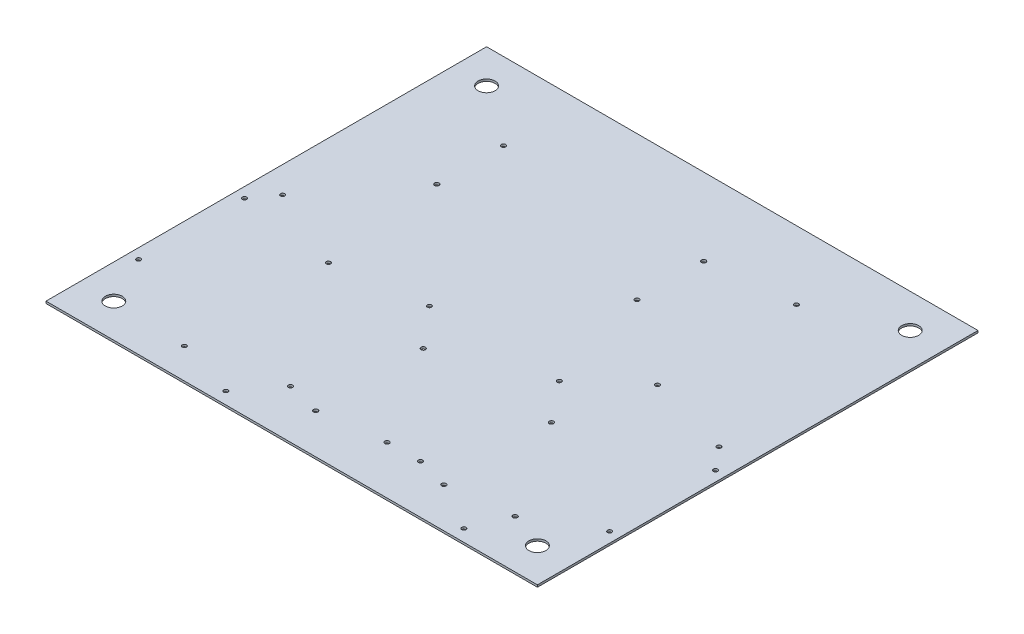
ISO-10303-21;
HEADER;
FILE_DESCRIPTION(('STEP AP214'),'2;1');
FILE_NAME('part.step','',(''),(''),'','','');
FILE_SCHEMA(('AUTOMOTIVE_DESIGN { 1 0 10303 214 1 1 1 1 }'));
ENDSEC;
DATA;
#1=APPLICATION_CONTEXT('core data for automotive mechanical design processes');
#2=APPLICATION_PROTOCOL_DEFINITION('international standard','automotive_design',2000,#1);
#3=PRODUCT_CONTEXT('',#1,'mechanical');
#4=PRODUCT('Part','Part','',(#3));
#5=PRODUCT_RELATED_PRODUCT_CATEGORY('part','',(#4));
#6=PRODUCT_DEFINITION_FORMATION('','',#4);
#7=PRODUCT_DEFINITION_CONTEXT('part definition',#1,'design');
#8=PRODUCT_DEFINITION('design','',#6,#7);
#9=PRODUCT_DEFINITION_SHAPE('','',#8);
#10=(LENGTH_UNIT() NAMED_UNIT(*) SI_UNIT(.MILLI.,.METRE.));
#11=(NAMED_UNIT(*) PLANE_ANGLE_UNIT() SI_UNIT($,.RADIAN.));
#12=(NAMED_UNIT(*) SI_UNIT($,.STERADIAN.) SOLID_ANGLE_UNIT());
#13=UNCERTAINTY_MEASURE_WITH_UNIT(LENGTH_MEASURE(1.E-05),#10,'distance_accuracy_value','');
#14=(GEOMETRIC_REPRESENTATION_CONTEXT(3) GLOBAL_UNCERTAINTY_ASSIGNED_CONTEXT((#13)) GLOBAL_UNIT_ASSIGNED_CONTEXT((#10,
#11,#12)) REPRESENTATION_CONTEXT('',''));
#15=CARTESIAN_POINT('',(0.,0.,0.));
#16=DIRECTION('',(0.,0.,1.));
#17=DIRECTION('',(1.,0.,0.));
#18=AXIS2_PLACEMENT_3D('',#15,#16,#17);
#19=CARTESIAN_POINT('',(184.15,1.5875,-165.1));
#20=DIRECTION('',(-1.,0.,0.));
#21=DIRECTION('',(0.,0.,1.));
#22=AXIS2_PLACEMENT_3D('',#19,#20,#21);
#23=PLANE('',#22);
#24=DIRECTION('',(0.,0.,-1.));
#25=VECTOR('',#24,1.);
#26=CARTESIAN_POINT('',(184.15,0.,-165.1));
#27=LINE('',#26,#25);
#28=CARTESIAN_POINT('',(184.15,0.,165.1));
#29=VERTEX_POINT('',#28);
#30=CARTESIAN_POINT('',(184.15,0.,-165.1));
#31=VERTEX_POINT('',#30);
#32=EDGE_CURVE('E107',#29,#31,#27,.T.);
#33=ORIENTED_EDGE('',*,*,#32,.T.);
#34=DIRECTION('',(0.,-1.,0.));
#35=VECTOR('',#34,1.);
#36=CARTESIAN_POINT('',(184.15,1.5875,-165.1));
#37=LINE('',#36,#35);
#38=CARTESIAN_POINT('',(184.15,1.5875,-165.1));
#39=VERTEX_POINT('',#38);
#40=EDGE_CURVE('E11',#39,#31,#37,.T.);
#41=ORIENTED_EDGE('',*,*,#40,.F.);
#42=DIRECTION('',(0.,0.,-1.));
#43=VECTOR('',#42,1.);
#44=CARTESIAN_POINT('',(184.15,1.5875,-165.1));
#45=LINE('',#44,#43);
#46=CARTESIAN_POINT('',(184.15,1.5875,165.1));
#47=VERTEX_POINT('',#46);
#48=EDGE_CURVE('E93',#47,#39,#45,.T.);
#49=ORIENTED_EDGE('',*,*,#48,.F.);
#50=DIRECTION('',(0.,-1.,0.));
#51=VECTOR('',#50,1.);
#52=CARTESIAN_POINT('',(184.15,1.5875,165.1));
#53=LINE('',#52,#51);
#54=EDGE_CURVE('E103',#47,#29,#53,.T.);
#55=ORIENTED_EDGE('',*,*,#54,.T.);
#56=EDGE_LOOP('',(#33,#41,#49,#55));
#57=FACE_BOUND('',#56,.T.);
#58=ADVANCED_FACE('F38',(#57),#23,.F.);
#59=CARTESIAN_POINT('',(-184.15,1.5875,-165.1));
#60=DIRECTION('',(0.,0.,1.));
#61=DIRECTION('',(1.,0.,0.));
#62=AXIS2_PLACEMENT_3D('',#59,#60,#61);
#63=PLANE('',#62);
#64=DIRECTION('',(-1.,0.,0.));
#65=VECTOR('',#64,1.);
#66=CARTESIAN_POINT('',(-184.15,0.,-165.1));
#67=LINE('',#66,#65);
#68=CARTESIAN_POINT('',(-184.15,0.,-165.1));
#69=VERTEX_POINT('',#68);
#70=EDGE_CURVE('E97',#31,#69,#67,.T.);
#71=ORIENTED_EDGE('',*,*,#70,.T.);
#72=DIRECTION('',(0.,-1.,0.));
#73=VECTOR('',#72,1.);
#74=CARTESIAN_POINT('',(-184.15,1.5875,-165.1));
#75=LINE('',#74,#73);
#76=CARTESIAN_POINT('',(-184.15,1.5875,-165.1));
#77=VERTEX_POINT('',#76);
#78=EDGE_CURVE('E47',#77,#69,#75,.T.);
#79=ORIENTED_EDGE('',*,*,#78,.F.);
#80=DIRECTION('',(-1.,0.,0.));
#81=VECTOR('',#80,1.);
#82=CARTESIAN_POINT('',(-184.15,1.5875,-165.1));
#83=LINE('',#82,#81);
#84=EDGE_CURVE('E88',#39,#77,#83,.T.);
#85=ORIENTED_EDGE('',*,*,#84,.F.);
#86=ORIENTED_EDGE('',*,*,#40,.T.);
#87=EDGE_LOOP('',(#71,#79,#85,#86));
#88=FACE_BOUND('',#87,.T.);
#89=ADVANCED_FACE('F96',(#88),#63,.F.);
#90=CARTESIAN_POINT('',(-184.15,1.5875,-165.1));
#91=DIRECTION('',(1.,0.,0.));
#92=DIRECTION('',(0.,0.,-1.));
#93=AXIS2_PLACEMENT_3D('',#90,#91,#92);
#94=PLANE('',#93);
#95=DIRECTION('',(0.,0.,1.));
#96=VECTOR('',#95,1.);
#97=CARTESIAN_POINT('',(-184.15,0.,-165.1));
#98=LINE('',#97,#96);
#99=CARTESIAN_POINT('',(-184.15,0.,165.1));
#100=VERTEX_POINT('',#99);
#101=EDGE_CURVE('E75',#69,#100,#98,.T.);
#102=ORIENTED_EDGE('',*,*,#101,.T.);
#103=DIRECTION('',(0.,-1.,0.));
#104=VECTOR('',#103,1.);
#105=CARTESIAN_POINT('',(-184.15,1.5875,165.1));
#106=LINE('',#105,#104);
#107=CARTESIAN_POINT('',(-184.15,1.5875,165.1));
#108=VERTEX_POINT('',#107);
#109=EDGE_CURVE('E98',#108,#100,#106,.T.);
#110=ORIENTED_EDGE('',*,*,#109,.F.);
#111=DIRECTION('',(0.,0.,1.));
#112=VECTOR('',#111,1.);
#113=CARTESIAN_POINT('',(-184.15,1.5875,-165.1));
#114=LINE('',#113,#112);
#115=EDGE_CURVE('E91',#77,#108,#114,.T.);
#116=ORIENTED_EDGE('',*,*,#115,.F.);
#117=ORIENTED_EDGE('',*,*,#78,.T.);
#118=EDGE_LOOP('',(#102,#110,#116,#117));
#119=FACE_BOUND('',#118,.T.);
#120=ADVANCED_FACE('F100',(#119),#94,.F.);
#121=CARTESIAN_POINT('',(-184.15,1.5875,165.1));
#122=DIRECTION('',(0.,0.,-1.));
#123=DIRECTION('',(-1.,0.,0.));
#124=AXIS2_PLACEMENT_3D('',#121,#122,#123);
#125=PLANE('',#124);
#126=DIRECTION('',(1.,0.,0.));
#127=VECTOR('',#126,1.);
#128=CARTESIAN_POINT('',(-184.15,0.,165.1));
#129=LINE('',#128,#127);
#130=EDGE_CURVE('E81',#100,#29,#129,.T.);
#131=ORIENTED_EDGE('',*,*,#130,.T.);
#132=ORIENTED_EDGE('',*,*,#54,.F.);
#133=DIRECTION('',(1.,0.,0.));
#134=VECTOR('',#133,1.);
#135=CARTESIAN_POINT('',(-184.15,1.5875,165.1));
#136=LINE('',#135,#134);
#137=EDGE_CURVE('E58',#108,#47,#136,.T.);
#138=ORIENTED_EDGE('',*,*,#137,.F.);
#139=ORIENTED_EDGE('',*,*,#109,.T.);
#140=EDGE_LOOP('',(#131,#132,#138,#139));
#141=FACE_BOUND('',#140,.T.);
#142=ADVANCED_FACE('F327',(#141),#125,.F.);
#143=CARTESIAN_POINT('',(0.,1.5875,0.));
#144=DIRECTION('',(0.,1.,0.));
#145=DIRECTION('',(0.,0.,1.));
#146=AXIS2_PLACEMENT_3D('',#143,#144,#145);
#147=PLANE('',#146);
#148=CARTESIAN_POINT('',(-103.15,1.5875,34.4000000000005));
#149=DIRECTION('',(0.,1.,0.));
#150=DIRECTION('',(0.,0.,1.));
#151=AXIS2_PLACEMENT_3D('',#148,#149,#150);
#152=CIRCLE('',#151,1.5875);
#153=CARTESIAN_POINT('',(-103.15,1.5875,35.9875000000005));
#154=VERTEX_POINT('',#153);
#155=EDGE_CURVE('E275',#154,#154,#152,.T.);
#156=ORIENTED_EDGE('',*,*,#155,.F.);
#157=EDGE_LOOP('',(#156));
#158=FACE_BOUND('',#157,.T.);
#159=CARTESIAN_POINT('',(-176.53,1.5875,103.365));
#160=DIRECTION('',(0.,1.,0.));
#161=DIRECTION('',(0.,0.,1.));
#162=AXIS2_PLACEMENT_3D('',#159,#160,#161);
#163=CIRCLE('',#162,1.58749999999999);
#164=CARTESIAN_POINT('',(-176.53,1.5875,104.9525));
#165=VERTEX_POINT('',#164);
#166=EDGE_CURVE('E280',#165,#165,#163,.T.);
#167=ORIENTED_EDGE('',*,*,#166,.F.);
#168=EDGE_LOOP('',(#167));
#169=FACE_BOUND('',#168,.T.);
#170=CARTESIAN_POINT('',(-176.53,1.5875,23.99));
#171=DIRECTION('',(0.,1.,0.));
#172=DIRECTION('',(0.,0.,1.));
#173=AXIS2_PLACEMENT_3D('',#170,#171,#172);
#174=CIRCLE('',#173,1.58749999999999);
#175=CARTESIAN_POINT('',(-176.53,1.5875,25.5775));
#176=VERTEX_POINT('',#175);
#177=EDGE_CURVE('E671',#176,#176,#174,.T.);
#178=ORIENTED_EDGE('',*,*,#177,.F.);
#179=EDGE_LOOP('',(#178));
#180=FACE_BOUND('',#179,.T.);
#181=CARTESIAN_POINT('',(-164.465,1.5875,7.47999999999999));
#182=DIRECTION('',(0.,1.,0.));
#183=DIRECTION('',(0.,0.,1.));
#184=AXIS2_PLACEMENT_3D('',#181,#182,#183);
#185=CIRCLE('',#184,1.58749999999999);
#186=CARTESIAN_POINT('',(-164.465,1.5875,9.06749999999997));
#187=VERTEX_POINT('',#186);
#188=EDGE_CURVE('E270',#187,#187,#185,.T.);
#189=ORIENTED_EDGE('',*,*,#188,.F.);
#190=EDGE_LOOP('',(#189));
#191=FACE_BOUND('',#190,.T.);
#192=CARTESIAN_POINT('',(176.53,1.5875,103.365));
#193=DIRECTION('',(0.,1.,0.));
#194=DIRECTION('',(0.,0.,1.));
#195=AXIS2_PLACEMENT_3D('',#192,#193,#194);
#196=CIRCLE('',#195,1.58749999999999);
#197=CARTESIAN_POINT('',(176.53,1.5875,104.9525));
#198=VERTEX_POINT('',#197);
#199=EDGE_CURVE('E264',#198,#198,#196,.T.);
#200=ORIENTED_EDGE('',*,*,#199,.F.);
#201=EDGE_LOOP('',(#200));
#202=FACE_BOUND('',#201,.T.);
#203=CARTESIAN_POINT('',(99.3723957699074,1.5875,-113.805));
#204=DIRECTION('',(0.,1.,0.));
#205=DIRECTION('',(0.,0.,1.));
#206=AXIS2_PLACEMENT_3D('',#203,#204,#205);
#207=CIRCLE('',#206,1.5875);
#208=CARTESIAN_POINT('',(99.3723957699074,1.5875,-112.2175));
#209=VERTEX_POINT('',#208);
#210=EDGE_CURVE('E681',#209,#209,#207,.T.);
#211=ORIENTED_EDGE('',*,*,#210,.F.);
#212=EDGE_LOOP('',(#211));
#213=FACE_BOUND('',#212,.T.);
#214=CARTESIAN_POINT('',(99.3723957699074,1.5875,-9.66499999999987));
#215=DIRECTION('',(0.,1.,0.));
#216=DIRECTION('',(0.,0.,1.));
#217=AXIS2_PLACEMENT_3D('',#214,#215,#216);
#218=CIRCLE('',#217,1.5875);
#219=CARTESIAN_POINT('',(99.3723957699074,1.5875,-8.07749999999987));
#220=VERTEX_POINT('',#219);
#221=EDGE_CURVE('E271',#220,#220,#218,.T.);
#222=ORIENTED_EDGE('',*,*,#221,.F.);
#223=EDGE_LOOP('',(#222));
#224=FACE_BOUND('',#223,.T.);
#225=CARTESIAN_POINT('',(162.56,1.5875,7.47999999999999));
#226=DIRECTION('',(0.,1.,0.));
#227=DIRECTION('',(0.,0.,1.));
#228=AXIS2_PLACEMENT_3D('',#225,#226,#227);
#229=CIRCLE('',#228,1.58749999999999);
#230=CARTESIAN_POINT('',(162.56,1.5875,9.06749999999997));
#231=VERTEX_POINT('',#230);
#232=EDGE_CURVE('E268',#231,#231,#229,.T.);
#233=ORIENTED_EDGE('',*,*,#232,.F.);
#234=EDGE_LOOP('',(#233));
#235=FACE_BOUND('',#234,.T.);
#236=CARTESIAN_POINT('',(-37.2337479726103,1.5875,24.625));
#237=DIRECTION('',(0.,1.,0.));
#238=DIRECTION('',(0.,0.,1.));
#239=AXIS2_PLACEMENT_3D('',#236,#237,#238);
#240=CIRCLE('',#239,1.5875);
#241=CARTESIAN_POINT('',(-37.2337479726103,1.5875,26.2125));
#242=VERTEX_POINT('',#241);
#243=EDGE_CURVE('E690',#242,#242,#240,.T.);
#244=ORIENTED_EDGE('',*,*,#243,.F.);
#245=EDGE_LOOP('',(#244));
#246=FACE_BOUND('',#245,.T.);
#247=CARTESIAN_POINT('',(60.1245495086379,1.5875,128.765));
#248=DIRECTION('',(0.,1.,0.));
#249=DIRECTION('',(0.,0.,1.));
#250=AXIS2_PLACEMENT_3D('',#247,#248,#249);
#251=CIRCLE('',#250,1.5875);
#252=CARTESIAN_POINT('',(60.1245495086379,1.5875,130.3525));
#253=VERTEX_POINT('',#252);
#254=EDGE_CURVE('E694',#253,#253,#251,.T.);
#255=ORIENTED_EDGE('',*,*,#254,.F.);
#256=EDGE_LOOP('',(#255));
#257=FACE_BOUND('',#256,.T.);
#258=CARTESIAN_POINT('',(60.1245495086379,1.5875,24.625));
#259=DIRECTION('',(0.,1.,0.));
#260=DIRECTION('',(0.,0.,1.));
#261=AXIS2_PLACEMENT_3D('',#258,#259,#260);
#262=CIRCLE('',#261,1.5875);
#263=CARTESIAN_POINT('',(60.1245495086379,1.5875,26.2125));
#264=VERTEX_POINT('',#263);
#265=EDGE_CURVE('E698',#264,#264,#262,.T.);
#266=ORIENTED_EDGE('',*,*,#265,.F.);
#267=EDGE_LOOP('',(#266));
#268=FACE_BOUND('',#267,.T.);
#269=CARTESIAN_POINT('',(-37.2337479726103,1.5875,128.765));
#270=DIRECTION('',(0.,1.,0.));
#271=DIRECTION('',(0.,0.,1.));
#272=AXIS2_PLACEMENT_3D('',#269,#270,#271);
#273=CIRCLE('',#272,1.5875);
#274=CARTESIAN_POINT('',(-37.2337479726103,1.5875,130.3525));
#275=VERTEX_POINT('',#274);
#276=EDGE_CURVE('E702',#275,#275,#273,.T.);
#277=ORIENTED_EDGE('',*,*,#276,.F.);
#278=EDGE_LOOP('',(#277));
#279=FACE_BOUND('',#278,.T.);
#280=CARTESIAN_POINT('',(-58.4149999999999,1.5875,156.07));
#281=DIRECTION('',(0.,1.,0.));
#282=DIRECTION('',(0.,0.,1.));
#283=AXIS2_PLACEMENT_3D('',#280,#281,#282);
#284=CIRCLE('',#283,1.5875);
#285=CARTESIAN_POINT('',(-58.4149999999999,1.5875,157.6575));
#286=VERTEX_POINT('',#285);
#287=EDGE_CURVE('E706',#286,#286,#284,.T.);
#288=ORIENTED_EDGE('',*,*,#287,.F.);
#289=EDGE_LOOP('',(#288));
#290=FACE_BOUND('',#289,.T.);
#291=CARTESIAN_POINT('',(120.02,1.5875,156.07));
#292=DIRECTION('',(0.,1.,0.));
#293=DIRECTION('',(0.,0.,1.));
#294=AXIS2_PLACEMENT_3D('',#291,#292,#293);
#295=CIRCLE('',#294,1.5875);
#296=CARTESIAN_POINT('',(120.02,1.5875,157.6575));
#297=VERTEX_POINT('',#296);
#298=EDGE_CURVE('E265',#297,#297,#295,.T.);
#299=ORIENTED_EDGE('',*,*,#298,.F.);
#300=EDGE_LOOP('',(#299));
#301=FACE_BOUND('',#300,.T.);
#302=CARTESIAN_POINT('',(176.53,1.5875,23.99));
#303=DIRECTION('',(0.,1.,0.));
#304=DIRECTION('',(0.,0.,1.));
#305=AXIS2_PLACEMENT_3D('',#302,#303,#304);
#306=CIRCLE('',#305,1.58749999999999);
#307=CARTESIAN_POINT('',(176.53,1.5875,25.5775));
#308=VERTEX_POINT('',#307);
#309=EDGE_CURVE('E262',#308,#308,#306,.T.);
#310=ORIENTED_EDGE('',*,*,#309,.F.);
#311=EDGE_LOOP('',(#310));
#312=FACE_BOUND('',#311,.T.);
#313=CARTESIAN_POINT('',(-103.15,1.5875,142.4));
#314=DIRECTION('',(0.,1.,0.));
#315=DIRECTION('',(0.,0.,1.));
#316=AXIS2_PLACEMENT_3D('',#313,#314,#315);
#317=CIRCLE('',#316,1.5875);
#318=CARTESIAN_POINT('',(-103.15,1.5875,143.9875));
#319=VERTEX_POINT('',#318);
#320=EDGE_CURVE('E124',#319,#319,#317,.T.);
#321=ORIENTED_EDGE('',*,*,#320,.F.);
#322=EDGE_LOOP('',(#321));
#323=FACE_BOUND('',#322,.T.);
#324=CARTESIAN_POINT('',(36.4499999999998,1.5875,-57.2000000000001));
#325=DIRECTION('',(0.,1.,0.));
#326=DIRECTION('',(0.,0.,1.));
#327=AXIS2_PLACEMENT_3D('',#324,#325,#326);
#328=CIRCLE('',#327,1.66499999999997);
#329=CARTESIAN_POINT('',(36.4499999999998,1.5875,-55.5350000000002));
#330=VERTEX_POINT('',#329);
#331=EDGE_CURVE('E172',#330,#330,#328,.T.);
#332=ORIENTED_EDGE('',*,*,#331,.F.);
#333=EDGE_LOOP('',(#332));
#334=FACE_BOUND('',#333,.T.);
#335=CARTESIAN_POINT('',(36.4499999999998,1.5875,-107.2));
#336=DIRECTION('',(0.,1.,0.));
#337=DIRECTION('',(0.,0.,1.));
#338=AXIS2_PLACEMENT_3D('',#335,#336,#337);
#339=CIRCLE('',#338,1.66500000000002);
#340=CARTESIAN_POINT('',(36.4499999999998,1.5875,-105.535));
#341=VERTEX_POINT('',#340);
#342=EDGE_CURVE('E181',#341,#341,#339,.T.);
#343=ORIENTED_EDGE('',*,*,#342,.F.);
#344=EDGE_LOOP('',(#343));
#345=FACE_BOUND('',#344,.T.);
#346=CARTESIAN_POINT('',(-113.55,1.5875,-107.2));
#347=DIRECTION('',(0.,1.,0.));
#348=DIRECTION('',(0.,0.,1.));
#349=AXIS2_PLACEMENT_3D('',#346,#347,#348);
#350=CIRCLE('',#349,1.66499999999996);
#351=CARTESIAN_POINT('',(-113.55,1.5875,-105.535));
#352=VERTEX_POINT('',#351);
#353=EDGE_CURVE('E284',#352,#352,#350,.T.);
#354=ORIENTED_EDGE('',*,*,#353,.F.);
#355=EDGE_LOOP('',(#354));
#356=FACE_BOUND('',#355,.T.);
#357=CARTESIAN_POINT('',(-113.55,1.5875,-57.2000000000002));
#358=DIRECTION('',(0.,1.,0.));
#359=DIRECTION('',(0.,0.,1.));
#360=AXIS2_PLACEMENT_3D('',#357,#358,#359);
#361=CIRCLE('',#360,1.66499999999996);
#362=CARTESIAN_POINT('',(-113.55,1.5875,-55.5350000000003));
#363=VERTEX_POINT('',#362);
#364=EDGE_CURVE('E187',#363,#363,#361,.T.);
#365=ORIENTED_EDGE('',*,*,#364,.F.);
#366=EDGE_LOOP('',(#365));
#367=FACE_BOUND('',#366,.T.);
#368=CARTESIAN_POINT('',(35.3434073054124,1.5875,128.976258797234));
#369=DIRECTION('',(0.,1.,0.));
#370=DIRECTION('',(0.,0.,1.));
#371=AXIS2_PLACEMENT_3D('',#368,#369,#370);
#372=CIRCLE('',#371,1.66500000000001);
#373=CARTESIAN_POINT('',(35.3434073054124,1.5875,130.641258797234));
#374=VERTEX_POINT('',#373);
#375=EDGE_CURVE('E207',#374,#374,#372,.F.);
#376=ORIENTED_EDGE('',*,*,#375,.T.);
#377=EDGE_LOOP('',(#376));
#378=FACE_BOUND('',#377,.T.);
#379=CARTESIAN_POINT('',(-12.0375887886655,1.5875,54.4642455034355));
#380=DIRECTION('',(0.,1.,0.));
#381=DIRECTION('',(0.,0.,1.));
#382=AXIS2_PLACEMENT_3D('',#379,#380,#381);
#383=CIRCLE('',#382,1.665);
#384=CARTESIAN_POINT('',(-12.0375887886655,1.5875,56.1292455034355));
#385=VERTEX_POINT('',#384);
#386=EDGE_CURVE('E213',#385,#385,#383,.F.);
#387=ORIENTED_EDGE('',*,*,#386,.T.);
#388=EDGE_LOOP('',(#387));
#389=FACE_BOUND('',#388,.T.);
#390=CARTESIAN_POINT('',(84.1208219470981,1.5875,135.184369152668));
#391=DIRECTION('',(0.,1.,0.));
#392=DIRECTION('',(0.,0.,1.));
#393=AXIS2_PLACEMENT_3D('',#390,#391,#392);
#394=CIRCLE('',#393,1.66500000000001);
#395=CARTESIAN_POINT('',(84.1208219470981,1.5875,136.849369152668));
#396=VERTEX_POINT('',#395);
#397=EDGE_CURVE('E220',#396,#396,#394,.F.);
#398=ORIENTED_EDGE('',*,*,#397,.T.);
#399=EDGE_LOOP('',(#398));
#400=FACE_BOUND('',#399,.T.);
#401=CARTESIAN_POINT('',(131.374103245115,1.5875,128.976258797234));
#402=DIRECTION('',(0.,1.,0.));
#403=DIRECTION('',(0.,0.,1.));
#404=AXIS2_PLACEMENT_3D('',#401,#402,#403);
#405=CIRCLE('',#404,1.66499999999999);
#406=CARTESIAN_POINT('',(131.374103245115,1.5875,130.641258797234));
#407=VERTEX_POINT('',#406);
#408=EDGE_CURVE('E199',#407,#407,#405,.F.);
#409=ORIENTED_EDGE('',*,*,#408,.T.);
#410=EDGE_LOOP('',(#409));
#411=FACE_BOUND('',#410,.T.);
#412=CARTESIAN_POINT('',(83.9931071510374,1.5875,54.4642455034354));
#413=DIRECTION('',(0.,1.,0.));
#414=DIRECTION('',(0.,0.,1.));
#415=AXIS2_PLACEMENT_3D('',#412,#413,#414);
#416=CIRCLE('',#415,1.66499999999999);
#417=CARTESIAN_POINT('',(83.9931071510374,1.5875,56.1292455034354));
#418=VERTEX_POINT('',#417);
#419=EDGE_CURVE('E194',#418,#418,#416,.F.);
#420=ORIENTED_EDGE('',*,*,#419,.T.);
#421=EDGE_LOOP('',(#420));
#422=FACE_BOUND('',#421,.T.);
#423=CARTESIAN_POINT('',(-11.9098739926048,1.5875,135.184369152668));
#424=DIRECTION('',(0.,1.,0.));
#425=DIRECTION('',(0.,0.,1.));
#426=AXIS2_PLACEMENT_3D('',#423,#424,#425);
#427=CIRCLE('',#426,1.66500000000002);
#428=CARTESIAN_POINT('',(-11.9098739926048,1.5875,136.849369152668));
#429=VERTEX_POINT('',#428);
#430=EDGE_CURVE('E206',#429,#429,#427,.F.);
#431=ORIENTED_EDGE('',*,*,#430,.T.);
#432=EDGE_LOOP('',(#431));
#433=FACE_BOUND('',#432,.T.);
#434=CARTESIAN_POINT('',(158.75,1.5875,139.7));
#435=DIRECTION('',(0.,1.,0.));
#436=DIRECTION('',(0.,0.,-1.));
#437=AXIS2_PLACEMENT_3D('',#434,#435,#436);
#438=CIRCLE('',#437,6.34999999999999);
#439=CARTESIAN_POINT('',(158.75,1.5875,133.35));
#440=VERTEX_POINT('',#439);
#441=EDGE_CURVE('E243',#440,#440,#438,.T.);
#442=ORIENTED_EDGE('',*,*,#441,.F.);
#443=EDGE_LOOP('',(#442));
#444=FACE_BOUND('',#443,.T.);
#445=CARTESIAN_POINT('',(-158.75,1.5875,-139.7));
#446=DIRECTION('',(0.,1.,0.));
#447=DIRECTION('',(0.,0.,-1.));
#448=AXIS2_PLACEMENT_3D('',#445,#446,#447);
#449=CIRCLE('',#448,6.34999999999999);
#450=CARTESIAN_POINT('',(-158.75,1.5875,-146.05));
#451=VERTEX_POINT('',#450);
#452=EDGE_CURVE('E242',#451,#451,#449,.T.);
#453=ORIENTED_EDGE('',*,*,#452,.F.);
#454=EDGE_LOOP('',(#453));
#455=FACE_BOUND('',#454,.T.);
#456=CARTESIAN_POINT('',(158.75,1.5875,-139.7));
#457=DIRECTION('',(0.,1.,0.));
#458=DIRECTION('',(0.,0.,1.));
#459=AXIS2_PLACEMENT_3D('',#456,#457,#458);
#460=CIRCLE('',#459,6.34999999999999);
#461=CARTESIAN_POINT('',(158.75,1.5875,-133.35));
#462=VERTEX_POINT('',#461);
#463=EDGE_CURVE('E234',#462,#462,#460,.T.);
#464=ORIENTED_EDGE('',*,*,#463,.F.);
#465=EDGE_LOOP('',(#464));
#466=FACE_BOUND('',#465,.T.);
#467=CARTESIAN_POINT('',(-158.75,1.5875,139.7));
#468=DIRECTION('',(0.,1.,0.));
#469=DIRECTION('',(0.,0.,1.));
#470=AXIS2_PLACEMENT_3D('',#467,#468,#469);
#471=CIRCLE('',#470,6.34999999999999);
#472=CARTESIAN_POINT('',(-158.75,1.5875,146.05));
#473=VERTEX_POINT('',#472);
#474=EDGE_CURVE('E252',#473,#473,#471,.T.);
#475=ORIENTED_EDGE('',*,*,#474,.F.);
#476=EDGE_LOOP('',(#475));
#477=FACE_BOUND('',#476,.T.);
#478=ORIENTED_EDGE('',*,*,#48,.T.);
#479=ORIENTED_EDGE('',*,*,#84,.T.);
#480=ORIENTED_EDGE('',*,*,#115,.T.);
#481=ORIENTED_EDGE('',*,*,#137,.T.);
#482=EDGE_LOOP('',(#478,#479,#480,#481));
#483=FACE_BOUND('',#482,.T.);
#484=ADVANCED_FACE('F89',(#158,#169,#180,#191,#202,#213,#224,#235,#246,#257,#268,#279,#290,#301,
#312,#323,#334,#345,#356,#367,#378,#389,#400,#411,#422,#433,#444,#455,#466,#477,#483),#147,.T.);
#485=CARTESIAN_POINT('',(0.,0.,0.));
#486=DIRECTION('',(0.,1.,0.));
#487=DIRECTION('',(0.,0.,1.));
#488=AXIS2_PLACEMENT_3D('',#485,#486,#487);
#489=PLANE('',#488);
#490=CARTESIAN_POINT('',(-103.15,0.,34.4000000000005));
#491=DIRECTION('',(0.,1.,0.));
#492=DIRECTION('',(0.,0.,1.));
#493=AXIS2_PLACEMENT_3D('',#490,#491,#492);
#494=CIRCLE('',#493,1.5875);
#495=CARTESIAN_POINT('',(-103.15,0.,35.9875000000005));
#496=VERTEX_POINT('',#495);
#497=EDGE_CURVE('E41',#496,#496,#494,.T.);
#498=ORIENTED_EDGE('',*,*,#497,.T.);
#499=EDGE_LOOP('',(#498));
#500=FACE_BOUND('',#499,.T.);
#501=CARTESIAN_POINT('',(-176.53,0.,103.365));
#502=DIRECTION('',(0.,1.,0.));
#503=DIRECTION('',(0.,0.,1.));
#504=AXIS2_PLACEMENT_3D('',#501,#502,#503);
#505=CIRCLE('',#504,1.58749999999999);
#506=CARTESIAN_POINT('',(-176.53,0.,104.9525));
#507=VERTEX_POINT('',#506);
#508=EDGE_CURVE('E166',#507,#507,#505,.T.);
#509=ORIENTED_EDGE('',*,*,#508,.T.);
#510=EDGE_LOOP('',(#509));
#511=FACE_BOUND('',#510,.T.);
#512=CARTESIAN_POINT('',(-176.53,0.,23.99));
#513=DIRECTION('',(0.,1.,0.));
#514=DIRECTION('',(0.,0.,1.));
#515=AXIS2_PLACEMENT_3D('',#512,#513,#514);
#516=CIRCLE('',#515,1.58749999999999);
#517=CARTESIAN_POINT('',(-176.53,0.,25.5775));
#518=VERTEX_POINT('',#517);
#519=EDGE_CURVE('E164',#518,#518,#516,.T.);
#520=ORIENTED_EDGE('',*,*,#519,.T.);
#521=EDGE_LOOP('',(#520));
#522=FACE_BOUND('',#521,.T.);
#523=CARTESIAN_POINT('',(-164.465,0.,7.47999999999999));
#524=DIRECTION('',(0.,1.,0.));
#525=DIRECTION('',(0.,0.,1.));
#526=AXIS2_PLACEMENT_3D('',#523,#524,#525);
#527=CIRCLE('',#526,1.58749999999999);
#528=CARTESIAN_POINT('',(-164.465,0.,9.06749999999997));
#529=VERTEX_POINT('',#528);
#530=EDGE_CURVE('E161',#529,#529,#527,.T.);
#531=ORIENTED_EDGE('',*,*,#530,.T.);
#532=EDGE_LOOP('',(#531));
#533=FACE_BOUND('',#532,.T.);
#534=CARTESIAN_POINT('',(176.53,0.,103.365));
#535=DIRECTION('',(0.,1.,0.));
#536=DIRECTION('',(0.,0.,1.));
#537=AXIS2_PLACEMENT_3D('',#534,#535,#536);
#538=CIRCLE('',#537,1.58749999999999);
#539=CARTESIAN_POINT('',(176.53,0.,104.9525));
#540=VERTEX_POINT('',#539);
#541=EDGE_CURVE('E157',#540,#540,#538,.T.);
#542=ORIENTED_EDGE('',*,*,#541,.T.);
#543=EDGE_LOOP('',(#542));
#544=FACE_BOUND('',#543,.T.);
#545=CARTESIAN_POINT('',(99.3723957699074,0.,-113.805));
#546=DIRECTION('',(0.,1.,0.));
#547=DIRECTION('',(0.,0.,1.));
#548=AXIS2_PLACEMENT_3D('',#545,#546,#547);
#549=CIRCLE('',#548,1.5875);
#550=CARTESIAN_POINT('',(99.3723957699074,0.,-112.2175));
#551=VERTEX_POINT('',#550);
#552=EDGE_CURVE('E154',#551,#551,#549,.T.);
#553=ORIENTED_EDGE('',*,*,#552,.T.);
#554=EDGE_LOOP('',(#553));
#555=FACE_BOUND('',#554,.T.);
#556=CARTESIAN_POINT('',(99.3723957699074,0.,-9.66499999999987));
#557=DIRECTION('',(0.,1.,0.));
#558=DIRECTION('',(0.,0.,1.));
#559=AXIS2_PLACEMENT_3D('',#556,#557,#558);
#560=CIRCLE('',#559,1.5875);
#561=CARTESIAN_POINT('',(99.3723957699074,0.,-8.07749999999987));
#562=VERTEX_POINT('',#561);
#563=EDGE_CURVE('E151',#562,#562,#560,.T.);
#564=ORIENTED_EDGE('',*,*,#563,.T.);
#565=EDGE_LOOP('',(#564));
#566=FACE_BOUND('',#565,.T.);
#567=CARTESIAN_POINT('',(162.56,0.,7.47999999999999));
#568=DIRECTION('',(0.,1.,0.));
#569=DIRECTION('',(0.,0.,1.));
#570=AXIS2_PLACEMENT_3D('',#567,#568,#569);
#571=CIRCLE('',#570,1.58749999999999);
#572=CARTESIAN_POINT('',(162.56,0.,9.06749999999997));
#573=VERTEX_POINT('',#572);
#574=EDGE_CURVE('E147',#573,#573,#571,.T.);
#575=ORIENTED_EDGE('',*,*,#574,.T.);
#576=EDGE_LOOP('',(#575));
#577=FACE_BOUND('',#576,.T.);
#578=CARTESIAN_POINT('',(-37.2337479726103,0.,24.625));
#579=DIRECTION('',(0.,1.,0.));
#580=DIRECTION('',(0.,0.,1.));
#581=AXIS2_PLACEMENT_3D('',#578,#579,#580);
#582=CIRCLE('',#581,1.5875);
#583=CARTESIAN_POINT('',(-37.2337479726103,0.,26.2125));
#584=VERTEX_POINT('',#583);
#585=EDGE_CURVE('E144',#584,#584,#582,.T.);
#586=ORIENTED_EDGE('',*,*,#585,.T.);
#587=EDGE_LOOP('',(#586));
#588=FACE_BOUND('',#587,.T.);
#589=CARTESIAN_POINT('',(60.1245495086379,0.,128.765));
#590=DIRECTION('',(0.,1.,0.));
#591=DIRECTION('',(0.,0.,1.));
#592=AXIS2_PLACEMENT_3D('',#589,#590,#591);
#593=CIRCLE('',#592,1.5875);
#594=CARTESIAN_POINT('',(60.1245495086379,0.,130.3525));
#595=VERTEX_POINT('',#594);
#596=EDGE_CURVE('E141',#595,#595,#593,.T.);
#597=ORIENTED_EDGE('',*,*,#596,.T.);
#598=EDGE_LOOP('',(#597));
#599=FACE_BOUND('',#598,.T.);
#600=CARTESIAN_POINT('',(60.1245495086379,0.,24.625));
#601=DIRECTION('',(0.,1.,0.));
#602=DIRECTION('',(0.,0.,1.));
#603=AXIS2_PLACEMENT_3D('',#600,#601,#602);
#604=CIRCLE('',#603,1.5875);
#605=CARTESIAN_POINT('',(60.1245495086379,0.,26.2125));
#606=VERTEX_POINT('',#605);
#607=EDGE_CURVE('E138',#606,#606,#604,.T.);
#608=ORIENTED_EDGE('',*,*,#607,.T.);
#609=EDGE_LOOP('',(#608));
#610=FACE_BOUND('',#609,.T.);
#611=CARTESIAN_POINT('',(-37.2337479726103,0.,128.765));
#612=DIRECTION('',(0.,1.,0.));
#613=DIRECTION('',(0.,0.,1.));
#614=AXIS2_PLACEMENT_3D('',#611,#612,#613);
#615=CIRCLE('',#614,1.5875);
#616=CARTESIAN_POINT('',(-37.2337479726103,0.,130.3525));
#617=VERTEX_POINT('',#616);
#618=EDGE_CURVE('E135',#617,#617,#615,.T.);
#619=ORIENTED_EDGE('',*,*,#618,.T.);
#620=EDGE_LOOP('',(#619));
#621=FACE_BOUND('',#620,.T.);
#622=CARTESIAN_POINT('',(-58.4149999999999,0.,156.07));
#623=DIRECTION('',(0.,1.,0.));
#624=DIRECTION('',(0.,0.,1.));
#625=AXIS2_PLACEMENT_3D('',#622,#623,#624);
#626=CIRCLE('',#625,1.5875);
#627=CARTESIAN_POINT('',(-58.4149999999999,0.,157.6575));
#628=VERTEX_POINT('',#627);
#629=EDGE_CURVE('E132',#628,#628,#626,.T.);
#630=ORIENTED_EDGE('',*,*,#629,.T.);
#631=EDGE_LOOP('',(#630));
#632=FACE_BOUND('',#631,.T.);
#633=CARTESIAN_POINT('',(120.02,0.,156.07));
#634=DIRECTION('',(0.,1.,0.));
#635=DIRECTION('',(0.,0.,1.));
#636=AXIS2_PLACEMENT_3D('',#633,#634,#635);
#637=CIRCLE('',#636,1.5875);
#638=CARTESIAN_POINT('',(120.02,0.,157.6575));
#639=VERTEX_POINT('',#638);
#640=EDGE_CURVE('E128',#639,#639,#637,.T.);
#641=ORIENTED_EDGE('',*,*,#640,.T.);
#642=EDGE_LOOP('',(#641));
#643=FACE_BOUND('',#642,.T.);
#644=CARTESIAN_POINT('',(176.53,0.,23.99));
#645=DIRECTION('',(0.,1.,0.));
#646=DIRECTION('',(0.,0.,1.));
#647=AXIS2_PLACEMENT_3D('',#644,#645,#646);
#648=CIRCLE('',#647,1.58749999999999);
#649=CARTESIAN_POINT('',(176.53,0.,25.5775));
#650=VERTEX_POINT('',#649);
#651=EDGE_CURVE('E123',#650,#650,#648,.T.);
#652=ORIENTED_EDGE('',*,*,#651,.T.);
#653=EDGE_LOOP('',(#652));
#654=FACE_BOUND('',#653,.T.);
#655=CARTESIAN_POINT('',(-103.15,0.,142.4));
#656=DIRECTION('',(0.,1.,0.));
#657=DIRECTION('',(0.,0.,1.));
#658=AXIS2_PLACEMENT_3D('',#655,#656,#657);
#659=CIRCLE('',#658,1.5875);
#660=CARTESIAN_POINT('',(-103.15,0.,143.9875));
#661=VERTEX_POINT('',#660);
#662=EDGE_CURVE('E119',#661,#661,#659,.T.);
#663=ORIENTED_EDGE('',*,*,#662,.T.);
#664=EDGE_LOOP('',(#663));
#665=FACE_BOUND('',#664,.T.);
#666=CARTESIAN_POINT('',(36.4499999999998,0.,-57.2000000000001));
#667=DIRECTION('',(0.,1.,0.));
#668=DIRECTION('',(0.,0.,1.));
#669=AXIS2_PLACEMENT_3D('',#666,#667,#668);
#670=CIRCLE('',#669,1.66499999999997);
#671=CARTESIAN_POINT('',(36.4499999999998,0.,-55.5350000000002));
#672=VERTEX_POINT('',#671);
#673=EDGE_CURVE('E176',#672,#672,#670,.F.);
#674=ORIENTED_EDGE('',*,*,#673,.F.);
#675=EDGE_LOOP('',(#674));
#676=FACE_BOUND('',#675,.T.);
#677=CARTESIAN_POINT('',(36.4499999999998,0.,-107.2));
#678=DIRECTION('',(0.,1.,0.));
#679=DIRECTION('',(0.,0.,1.));
#680=AXIS2_PLACEMENT_3D('',#677,#678,#679);
#681=CIRCLE('',#680,1.66500000000002);
#682=CARTESIAN_POINT('',(36.4499999999998,0.,-105.535));
#683=VERTEX_POINT('',#682);
#684=EDGE_CURVE('E184',#683,#683,#681,.F.);
#685=ORIENTED_EDGE('',*,*,#684,.F.);
#686=EDGE_LOOP('',(#685));
#687=FACE_BOUND('',#686,.T.);
#688=CARTESIAN_POINT('',(-113.55,0.,-107.2));
#689=DIRECTION('',(0.,1.,0.));
#690=DIRECTION('',(0.,0.,1.));
#691=AXIS2_PLACEMENT_3D('',#688,#689,#690);
#692=CIRCLE('',#691,1.66499999999996);
#693=CARTESIAN_POINT('',(-113.55,0.,-105.535));
#694=VERTEX_POINT('',#693);
#695=EDGE_CURVE('E191',#694,#694,#692,.F.);
#696=ORIENTED_EDGE('',*,*,#695,.F.);
#697=EDGE_LOOP('',(#696));
#698=FACE_BOUND('',#697,.T.);
#699=CARTESIAN_POINT('',(-113.55,0.,-57.2000000000002));
#700=DIRECTION('',(0.,1.,0.));
#701=DIRECTION('',(0.,0.,1.));
#702=AXIS2_PLACEMENT_3D('',#699,#700,#701);
#703=CIRCLE('',#702,1.66499999999996);
#704=CARTESIAN_POINT('',(-113.55,0.,-55.5350000000003));
#705=VERTEX_POINT('',#704);
#706=EDGE_CURVE('E190',#705,#705,#703,.F.);
#707=ORIENTED_EDGE('',*,*,#706,.F.);
#708=EDGE_LOOP('',(#707));
#709=FACE_BOUND('',#708,.T.);
#710=CARTESIAN_POINT('',(35.3434073054124,0.,128.976258797234));
#711=DIRECTION('',(0.,-1.,0.));
#712=DIRECTION('',(0.,0.,-1.));
#713=AXIS2_PLACEMENT_3D('',#710,#711,#712);
#714=CIRCLE('',#713,1.66500000000001);
#715=CARTESIAN_POINT('',(35.3434073054124,0.,127.311258797234));
#716=VERTEX_POINT('',#715);
#717=EDGE_CURVE('E203',#716,#716,#714,.T.);
#718=ORIENTED_EDGE('',*,*,#717,.F.);
#719=EDGE_LOOP('',(#718));
#720=FACE_BOUND('',#719,.T.);
#721=CARTESIAN_POINT('',(-12.0375887886655,0.,54.4642455034355));
#722=DIRECTION('',(0.,-1.,0.));
#723=DIRECTION('',(0.,0.,-1.));
#724=AXIS2_PLACEMENT_3D('',#721,#722,#723);
#725=CIRCLE('',#724,1.665);
#726=CARTESIAN_POINT('',(-12.0375887886655,0.,52.7992455034355));
#727=VERTEX_POINT('',#726);
#728=EDGE_CURVE('E210',#727,#727,#725,.T.);
#729=ORIENTED_EDGE('',*,*,#728,.F.);
#730=EDGE_LOOP('',(#729));
#731=FACE_BOUND('',#730,.T.);
#732=CARTESIAN_POINT('',(84.1208219470981,0.,135.184369152668));
#733=DIRECTION('',(0.,-1.,0.));
#734=DIRECTION('',(0.,0.,-1.));
#735=AXIS2_PLACEMENT_3D('',#732,#733,#734);
#736=CIRCLE('',#735,1.66500000000001);
#737=CARTESIAN_POINT('',(84.1208219470981,0.,133.519369152668));
#738=VERTEX_POINT('',#737);
#739=EDGE_CURVE('E216',#738,#738,#736,.T.);
#740=ORIENTED_EDGE('',*,*,#739,.F.);
#741=EDGE_LOOP('',(#740));
#742=FACE_BOUND('',#741,.T.);
#743=CARTESIAN_POINT('',(131.374103245115,0.,128.976258797234));
#744=DIRECTION('',(0.,-1.,0.));
#745=DIRECTION('',(0.,0.,-1.));
#746=AXIS2_PLACEMENT_3D('',#743,#744,#745);
#747=CIRCLE('',#746,1.66499999999999);
#748=CARTESIAN_POINT('',(131.374103245115,0.,127.311258797234));
#749=VERTEX_POINT('',#748);
#750=EDGE_CURVE('E224',#749,#749,#747,.T.);
#751=ORIENTED_EDGE('',*,*,#750,.F.);
#752=EDGE_LOOP('',(#751));
#753=FACE_BOUND('',#752,.T.);
#754=CARTESIAN_POINT('',(83.9931071510374,0.,54.4642455034354));
#755=DIRECTION('',(0.,-1.,0.));
#756=DIRECTION('',(0.,0.,-1.));
#757=AXIS2_PLACEMENT_3D('',#754,#755,#756);
#758=CIRCLE('',#757,1.66499999999999);
#759=CARTESIAN_POINT('',(83.9931071510374,0.,52.7992455034354));
#760=VERTEX_POINT('',#759);
#761=EDGE_CURVE('E195',#760,#760,#758,.T.);
#762=ORIENTED_EDGE('',*,*,#761,.F.);
#763=EDGE_LOOP('',(#762));
#764=FACE_BOUND('',#763,.T.);
#765=CARTESIAN_POINT('',(-11.9098739926048,0.,135.184369152668));
#766=DIRECTION('',(0.,-1.,0.));
#767=DIRECTION('',(0.,0.,-1.));
#768=AXIS2_PLACEMENT_3D('',#765,#766,#767);
#769=CIRCLE('',#768,1.66500000000002);
#770=CARTESIAN_POINT('',(-11.9098739926048,0.,133.519369152668));
#771=VERTEX_POINT('',#770);
#772=EDGE_CURVE('E231',#771,#771,#769,.T.);
#773=ORIENTED_EDGE('',*,*,#772,.F.);
#774=EDGE_LOOP('',(#773));
#775=FACE_BOUND('',#774,.T.);
#776=CARTESIAN_POINT('',(158.75,0.,139.7));
#777=DIRECTION('',(0.,1.,0.));
#778=DIRECTION('',(0.,0.,1.));
#779=AXIS2_PLACEMENT_3D('',#776,#777,#778);
#780=CIRCLE('',#779,6.34999999999999);
#781=CARTESIAN_POINT('',(158.75,0.,146.05));
#782=VERTEX_POINT('',#781);
#783=EDGE_CURVE('E247',#782,#782,#780,.F.);
#784=ORIENTED_EDGE('',*,*,#783,.F.);
#785=EDGE_LOOP('',(#784));
#786=FACE_BOUND('',#785,.T.);
#787=CARTESIAN_POINT('',(-158.75,0.,-139.7));
#788=DIRECTION('',(0.,1.,0.));
#789=DIRECTION('',(0.,0.,1.));
#790=AXIS2_PLACEMENT_3D('',#787,#788,#789);
#791=CIRCLE('',#790,6.34999999999999);
#792=CARTESIAN_POINT('',(-158.75,0.,-133.35));
#793=VERTEX_POINT('',#792);
#794=EDGE_CURVE('E248',#793,#793,#791,.F.);
#795=ORIENTED_EDGE('',*,*,#794,.F.);
#796=EDGE_LOOP('',(#795));
#797=FACE_BOUND('',#796,.T.);
#798=CARTESIAN_POINT('',(158.75,0.,-139.7));
#799=DIRECTION('',(0.,1.,0.));
#800=DIRECTION('',(0.,0.,1.));
#801=AXIS2_PLACEMENT_3D('',#798,#799,#800);
#802=CIRCLE('',#801,6.34999999999999);
#803=CARTESIAN_POINT('',(158.75,0.,-133.35));
#804=VERTEX_POINT('',#803);
#805=EDGE_CURVE('E239',#804,#804,#802,.F.);
#806=ORIENTED_EDGE('',*,*,#805,.F.);
#807=EDGE_LOOP('',(#806));
#808=FACE_BOUND('',#807,.T.);
#809=CARTESIAN_POINT('',(-158.75,0.,139.7));
#810=DIRECTION('',(0.,1.,0.));
#811=DIRECTION('',(0.,0.,1.));
#812=AXIS2_PLACEMENT_3D('',#809,#810,#811);
#813=CIRCLE('',#812,6.34999999999999);
#814=CARTESIAN_POINT('',(-158.75,0.,146.05));
#815=VERTEX_POINT('',#814);
#816=EDGE_CURVE('E111',#815,#815,#813,.F.);
#817=ORIENTED_EDGE('',*,*,#816,.F.);
#818=EDGE_LOOP('',(#817));
#819=FACE_BOUND('',#818,.T.);
#820=ORIENTED_EDGE('',*,*,#32,.F.);
#821=ORIENTED_EDGE('',*,*,#130,.F.);
#822=ORIENTED_EDGE('',*,*,#101,.F.);
#823=ORIENTED_EDGE('',*,*,#70,.F.);
#824=EDGE_LOOP('',(#820,#821,#822,#823));
#825=FACE_BOUND('',#824,.T.);
#826=ADVANCED_FACE('F296',(#500,#511,#522,#533,#544,#555,#566,#577,#588,#599,#610,#621,#632,
#643,#654,#665,#676,#687,#698,#709,#720,#731,#742,#753,#764,#775,#786,#797,#808,#819,#825),#489,.F.);
#827=CARTESIAN_POINT('',(-158.75,-0.000999999999999916,139.7));
#828=DIRECTION('',(0.,1.,0.));
#829=DIRECTION('',(0.,0.,1.));
#830=AXIS2_PLACEMENT_3D('',#827,#828,#829);
#831=CYLINDRICAL_SURFACE('',#830,6.34999999999999);
#832=ORIENTED_EDGE('',*,*,#474,.T.);
#833=EDGE_LOOP('',(#832));
#834=FACE_BOUND('',#833,.T.);
#835=ORIENTED_EDGE('',*,*,#816,.T.);
#836=EDGE_LOOP('',(#835));
#837=FACE_BOUND('',#836,.T.);
#838=ADVANCED_FACE('F299',(#834,#837),#831,.F.);
#839=CARTESIAN_POINT('',(158.75,-0.000999999999999916,-139.7));
#840=DIRECTION('',(0.,1.,0.));
#841=DIRECTION('',(0.,0.,1.));
#842=AXIS2_PLACEMENT_3D('',#839,#840,#841);
#843=CYLINDRICAL_SURFACE('',#842,6.34999999999999);
#844=ORIENTED_EDGE('',*,*,#463,.T.);
#845=EDGE_LOOP('',(#844));
#846=FACE_BOUND('',#845,.T.);
#847=ORIENTED_EDGE('',*,*,#805,.T.);
#848=EDGE_LOOP('',(#847));
#849=FACE_BOUND('',#848,.T.);
#850=ADVANCED_FACE('F361',(#846,#849),#843,.F.);
#851=CARTESIAN_POINT('',(-158.75,-0.000999999999999916,-139.7));
#852=DIRECTION('',(0.,1.,0.));
#853=DIRECTION('',(0.,0.,1.));
#854=AXIS2_PLACEMENT_3D('',#851,#852,#853);
#855=CYLINDRICAL_SURFACE('',#854,6.34999999999999);
#856=ORIENTED_EDGE('',*,*,#452,.T.);
#857=EDGE_LOOP('',(#856));
#858=FACE_BOUND('',#857,.T.);
#859=ORIENTED_EDGE('',*,*,#794,.T.);
#860=EDGE_LOOP('',(#859));
#861=FACE_BOUND('',#860,.T.);
#862=ADVANCED_FACE('F372',(#858,#861),#855,.F.);
#863=CARTESIAN_POINT('',(158.75,-0.000999999999999916,139.7));
#864=DIRECTION('',(0.,1.,0.));
#865=DIRECTION('',(0.,0.,1.));
#866=AXIS2_PLACEMENT_3D('',#863,#864,#865);
#867=CYLINDRICAL_SURFACE('',#866,6.34999999999999);
#868=ORIENTED_EDGE('',*,*,#441,.T.);
#869=EDGE_LOOP('',(#868));
#870=FACE_BOUND('',#869,.T.);
#871=ORIENTED_EDGE('',*,*,#783,.T.);
#872=EDGE_LOOP('',(#871));
#873=FACE_BOUND('',#872,.T.);
#874=ADVANCED_FACE('F382',(#870,#873),#867,.F.);
#875=CARTESIAN_POINT('',(-11.9098739926048,1.5885,135.184369152668));
#876=DIRECTION('',(0.,-1.,0.));
#877=DIRECTION('',(0.,0.,-1.));
#878=AXIS2_PLACEMENT_3D('',#875,#876,#877);
#879=CYLINDRICAL_SURFACE('',#878,1.66500000000002);
#880=ORIENTED_EDGE('',*,*,#430,.F.);
#881=EDGE_LOOP('',(#880));
#882=FACE_BOUND('',#881,.T.);
#883=ORIENTED_EDGE('',*,*,#772,.T.);
#884=EDGE_LOOP('',(#883));
#885=FACE_BOUND('',#884,.T.);
#886=ADVANCED_FACE('F393',(#882,#885),#879,.F.);
#887=CARTESIAN_POINT('',(83.9931071510374,1.5885,54.4642455034354));
#888=DIRECTION('',(0.,-1.,0.));
#889=DIRECTION('',(0.,0.,-1.));
#890=AXIS2_PLACEMENT_3D('',#887,#888,#889);
#891=CYLINDRICAL_SURFACE('',#890,1.66499999999999);
#892=ORIENTED_EDGE('',*,*,#419,.F.);
#893=EDGE_LOOP('',(#892));
#894=FACE_BOUND('',#893,.T.);
#895=ORIENTED_EDGE('',*,*,#761,.T.);
#896=EDGE_LOOP('',(#895));
#897=FACE_BOUND('',#896,.T.);
#898=ADVANCED_FACE('F403',(#894,#897),#891,.F.);
#899=CARTESIAN_POINT('',(131.374103245115,1.5885,128.976258797234));
#900=DIRECTION('',(0.,-1.,0.));
#901=DIRECTION('',(0.,0.,-1.));
#902=AXIS2_PLACEMENT_3D('',#899,#900,#901);
#903=CYLINDRICAL_SURFACE('',#902,1.66499999999999);
#904=ORIENTED_EDGE('',*,*,#408,.F.);
#905=EDGE_LOOP('',(#904));
#906=FACE_BOUND('',#905,.T.);
#907=ORIENTED_EDGE('',*,*,#750,.T.);
#908=EDGE_LOOP('',(#907));
#909=FACE_BOUND('',#908,.T.);
#910=ADVANCED_FACE('F413',(#906,#909),#903,.F.);
#911=CARTESIAN_POINT('',(84.1208219470981,1.5885,135.184369152668));
#912=DIRECTION('',(0.,-1.,0.));
#913=DIRECTION('',(0.,0.,-1.));
#914=AXIS2_PLACEMENT_3D('',#911,#912,#913);
#915=CYLINDRICAL_SURFACE('',#914,1.66500000000001);
#916=ORIENTED_EDGE('',*,*,#397,.F.);
#917=EDGE_LOOP('',(#916));
#918=FACE_BOUND('',#917,.T.);
#919=ORIENTED_EDGE('',*,*,#739,.T.);
#920=EDGE_LOOP('',(#919));
#921=FACE_BOUND('',#920,.T.);
#922=ADVANCED_FACE('F423',(#918,#921),#915,.F.);
#923=CARTESIAN_POINT('',(-12.0375887886655,1.5885,54.4642455034355));
#924=DIRECTION('',(0.,-1.,0.));
#925=DIRECTION('',(0.,0.,-1.));
#926=AXIS2_PLACEMENT_3D('',#923,#924,#925);
#927=CYLINDRICAL_SURFACE('',#926,1.665);
#928=ORIENTED_EDGE('',*,*,#386,.F.);
#929=EDGE_LOOP('',(#928));
#930=FACE_BOUND('',#929,.T.);
#931=ORIENTED_EDGE('',*,*,#728,.T.);
#932=EDGE_LOOP('',(#931));
#933=FACE_BOUND('',#932,.T.);
#934=ADVANCED_FACE('F433',(#930,#933),#927,.F.);
#935=CARTESIAN_POINT('',(35.3434073054124,1.5885,128.976258797234));
#936=DIRECTION('',(0.,-1.,0.));
#937=DIRECTION('',(0.,0.,-1.));
#938=AXIS2_PLACEMENT_3D('',#935,#936,#937);
#939=CYLINDRICAL_SURFACE('',#938,1.66500000000001);
#940=ORIENTED_EDGE('',*,*,#375,.F.);
#941=EDGE_LOOP('',(#940));
#942=FACE_BOUND('',#941,.T.);
#943=ORIENTED_EDGE('',*,*,#717,.T.);
#944=EDGE_LOOP('',(#943));
#945=FACE_BOUND('',#944,.T.);
#946=ADVANCED_FACE('F443',(#942,#945),#939,.F.);
#947=CARTESIAN_POINT('',(-113.55,-0.000999999999999916,-57.2000000000002));
#948=DIRECTION('',(0.,1.,0.));
#949=DIRECTION('',(0.,0.,1.));
#950=AXIS2_PLACEMENT_3D('',#947,#948,#949);
#951=CYLINDRICAL_SURFACE('',#950,1.66499999999996);
#952=ORIENTED_EDGE('',*,*,#364,.T.);
#953=EDGE_LOOP('',(#952));
#954=FACE_BOUND('',#953,.T.);
#955=ORIENTED_EDGE('',*,*,#706,.T.);
#956=EDGE_LOOP('',(#955));
#957=FACE_BOUND('',#956,.T.);
#958=ADVANCED_FACE('F453',(#954,#957),#951,.F.);
#959=CARTESIAN_POINT('',(-113.55,-0.000999999999999916,-107.2));
#960=DIRECTION('',(0.,1.,0.));
#961=DIRECTION('',(0.,0.,1.));
#962=AXIS2_PLACEMENT_3D('',#959,#960,#961);
#963=CYLINDRICAL_SURFACE('',#962,1.66499999999996);
#964=ORIENTED_EDGE('',*,*,#353,.T.);
#965=EDGE_LOOP('',(#964));
#966=FACE_BOUND('',#965,.T.);
#967=ORIENTED_EDGE('',*,*,#695,.T.);
#968=EDGE_LOOP('',(#967));
#969=FACE_BOUND('',#968,.T.);
#970=ADVANCED_FACE('F463',(#966,#969),#963,.F.);
#971=CARTESIAN_POINT('',(36.4499999999998,-0.000999999999999916,-107.2));
#972=DIRECTION('',(0.,1.,0.));
#973=DIRECTION('',(0.,0.,1.));
#974=AXIS2_PLACEMENT_3D('',#971,#972,#973);
#975=CYLINDRICAL_SURFACE('',#974,1.66500000000002);
#976=ORIENTED_EDGE('',*,*,#342,.T.);
#977=EDGE_LOOP('',(#976));
#978=FACE_BOUND('',#977,.T.);
#979=ORIENTED_EDGE('',*,*,#684,.T.);
#980=EDGE_LOOP('',(#979));
#981=FACE_BOUND('',#980,.T.);
#982=ADVANCED_FACE('F294',(#978,#981),#975,.F.);
#983=CARTESIAN_POINT('',(36.4499999999998,-0.000999999999999916,-57.2000000000001));
#984=DIRECTION('',(0.,1.,0.));
#985=DIRECTION('',(0.,0.,1.));
#986=AXIS2_PLACEMENT_3D('',#983,#984,#985);
#987=CYLINDRICAL_SURFACE('',#986,1.66499999999997);
#988=ORIENTED_EDGE('',*,*,#331,.T.);
#989=EDGE_LOOP('',(#988));
#990=FACE_BOUND('',#989,.T.);
#991=ORIENTED_EDGE('',*,*,#673,.T.);
#992=EDGE_LOOP('',(#991));
#993=FACE_BOUND('',#992,.T.);
#994=ADVANCED_FACE('F482',(#990,#993),#987,.F.);
#995=CARTESIAN_POINT('',(-103.15,-0.9525,142.4));
#996=DIRECTION('',(0.,1.,0.));
#997=DIRECTION('',(0.,0.,1.));
#998=AXIS2_PLACEMENT_3D('',#995,#996,#997);
#999=CYLINDRICAL_SURFACE('',#998,1.5875);
#1000=ORIENTED_EDGE('',*,*,#320,.T.);
#1001=EDGE_LOOP('',(#1000));
#1002=FACE_BOUND('',#1001,.T.);
#1003=ORIENTED_EDGE('',*,*,#662,.F.);
#1004=EDGE_LOOP('',(#1003));
#1005=FACE_BOUND('',#1004,.T.);
#1006=ADVANCED_FACE('F491',(#1002,#1005),#999,.F.);
#1007=CARTESIAN_POINT('',(176.53,-0.9525,23.99));
#1008=DIRECTION('',(0.,1.,0.));
#1009=DIRECTION('',(0.,0.,1.));
#1010=AXIS2_PLACEMENT_3D('',#1007,#1008,#1009);
#1011=CYLINDRICAL_SURFACE('',#1010,1.58749999999999);
#1012=ORIENTED_EDGE('',*,*,#309,.T.);
#1013=EDGE_LOOP('',(#1012));
#1014=FACE_BOUND('',#1013,.T.);
#1015=ORIENTED_EDGE('',*,*,#651,.F.);
#1016=EDGE_LOOP('',(#1015));
#1017=FACE_BOUND('',#1016,.T.);
#1018=ADVANCED_FACE('F509',(#1014,#1017),#1011,.F.);
#1019=CARTESIAN_POINT('',(120.02,-0.9525,156.07));
#1020=DIRECTION('',(0.,1.,0.));
#1021=DIRECTION('',(0.,0.,1.));
#1022=AXIS2_PLACEMENT_3D('',#1019,#1020,#1021);
#1023=CYLINDRICAL_SURFACE('',#1022,1.5875);
#1024=ORIENTED_EDGE('',*,*,#298,.T.);
#1025=EDGE_LOOP('',(#1024));
#1026=FACE_BOUND('',#1025,.T.);
#1027=ORIENTED_EDGE('',*,*,#640,.F.);
#1028=EDGE_LOOP('',(#1027));
#1029=FACE_BOUND('',#1028,.T.);
#1030=ADVANCED_FACE('F518',(#1026,#1029),#1023,.F.);
#1031=CARTESIAN_POINT('',(-58.4149999999999,-0.9525,156.07));
#1032=DIRECTION('',(0.,1.,0.));
#1033=DIRECTION('',(0.,0.,1.));
#1034=AXIS2_PLACEMENT_3D('',#1031,#1032,#1033);
#1035=CYLINDRICAL_SURFACE('',#1034,1.5875);
#1036=ORIENTED_EDGE('',*,*,#287,.T.);
#1037=EDGE_LOOP('',(#1036));
#1038=FACE_BOUND('',#1037,.T.);
#1039=ORIENTED_EDGE('',*,*,#629,.F.);
#1040=EDGE_LOOP('',(#1039));
#1041=FACE_BOUND('',#1040,.T.);
#1042=ADVANCED_FACE('F528',(#1038,#1041),#1035,.F.);
#1043=CARTESIAN_POINT('',(-37.2337479726103,-0.9525,128.765));
#1044=DIRECTION('',(0.,1.,0.));
#1045=DIRECTION('',(0.,0.,1.));
#1046=AXIS2_PLACEMENT_3D('',#1043,#1044,#1045);
#1047=CYLINDRICAL_SURFACE('',#1046,1.5875);
#1048=ORIENTED_EDGE('',*,*,#276,.T.);
#1049=EDGE_LOOP('',(#1048));
#1050=FACE_BOUND('',#1049,.T.);
#1051=ORIENTED_EDGE('',*,*,#618,.F.);
#1052=EDGE_LOOP('',(#1051));
#1053=FACE_BOUND('',#1052,.T.);
#1054=ADVANCED_FACE('F538',(#1050,#1053),#1047,.F.);
#1055=CARTESIAN_POINT('',(60.1245495086379,-0.9525,24.625));
#1056=DIRECTION('',(0.,1.,0.));
#1057=DIRECTION('',(0.,0.,1.));
#1058=AXIS2_PLACEMENT_3D('',#1055,#1056,#1057);
#1059=CYLINDRICAL_SURFACE('',#1058,1.5875);
#1060=ORIENTED_EDGE('',*,*,#265,.T.);
#1061=EDGE_LOOP('',(#1060));
#1062=FACE_BOUND('',#1061,.T.);
#1063=ORIENTED_EDGE('',*,*,#607,.F.);
#1064=EDGE_LOOP('',(#1063));
#1065=FACE_BOUND('',#1064,.T.);
#1066=ADVANCED_FACE('F548',(#1062,#1065),#1059,.F.);
#1067=CARTESIAN_POINT('',(60.1245495086379,-0.9525,128.765));
#1068=DIRECTION('',(0.,1.,0.));
#1069=DIRECTION('',(0.,0.,1.));
#1070=AXIS2_PLACEMENT_3D('',#1067,#1068,#1069);
#1071=CYLINDRICAL_SURFACE('',#1070,1.5875);
#1072=ORIENTED_EDGE('',*,*,#254,.T.);
#1073=EDGE_LOOP('',(#1072));
#1074=FACE_BOUND('',#1073,.T.);
#1075=ORIENTED_EDGE('',*,*,#596,.F.);
#1076=EDGE_LOOP('',(#1075));
#1077=FACE_BOUND('',#1076,.T.);
#1078=ADVANCED_FACE('F558',(#1074,#1077),#1071,.F.);
#1079=CARTESIAN_POINT('',(-37.2337479726103,-0.9525,24.625));
#1080=DIRECTION('',(0.,1.,0.));
#1081=DIRECTION('',(0.,0.,1.));
#1082=AXIS2_PLACEMENT_3D('',#1079,#1080,#1081);
#1083=CYLINDRICAL_SURFACE('',#1082,1.5875);
#1084=ORIENTED_EDGE('',*,*,#243,.T.);
#1085=EDGE_LOOP('',(#1084));
#1086=FACE_BOUND('',#1085,.T.);
#1087=ORIENTED_EDGE('',*,*,#585,.F.);
#1088=EDGE_LOOP('',(#1087));
#1089=FACE_BOUND('',#1088,.T.);
#1090=ADVANCED_FACE('F568',(#1086,#1089),#1083,.F.);
#1091=CARTESIAN_POINT('',(162.56,-0.9525,7.47999999999999));
#1092=DIRECTION('',(0.,1.,0.));
#1093=DIRECTION('',(0.,0.,1.));
#1094=AXIS2_PLACEMENT_3D('',#1091,#1092,#1093);
#1095=CYLINDRICAL_SURFACE('',#1094,1.58749999999999);
#1096=ORIENTED_EDGE('',*,*,#232,.T.);
#1097=EDGE_LOOP('',(#1096));
#1098=FACE_BOUND('',#1097,.T.);
#1099=ORIENTED_EDGE('',*,*,#574,.F.);
#1100=EDGE_LOOP('',(#1099));
#1101=FACE_BOUND('',#1100,.T.);
#1102=ADVANCED_FACE('F578',(#1098,#1101),#1095,.F.);
#1103=CARTESIAN_POINT('',(99.3723957699074,-0.9525,-9.66499999999987));
#1104=DIRECTION('',(0.,1.,0.));
#1105=DIRECTION('',(0.,0.,1.));
#1106=AXIS2_PLACEMENT_3D('',#1103,#1104,#1105);
#1107=CYLINDRICAL_SURFACE('',#1106,1.5875);
#1108=ORIENTED_EDGE('',*,*,#221,.T.);
#1109=EDGE_LOOP('',(#1108));
#1110=FACE_BOUND('',#1109,.T.);
#1111=ORIENTED_EDGE('',*,*,#563,.F.);
#1112=EDGE_LOOP('',(#1111));
#1113=FACE_BOUND('',#1112,.T.);
#1114=ADVANCED_FACE('F588',(#1110,#1113),#1107,.F.);
#1115=CARTESIAN_POINT('',(99.3723957699074,-0.9525,-113.805));
#1116=DIRECTION('',(0.,1.,0.));
#1117=DIRECTION('',(0.,0.,1.));
#1118=AXIS2_PLACEMENT_3D('',#1115,#1116,#1117);
#1119=CYLINDRICAL_SURFACE('',#1118,1.5875);
#1120=ORIENTED_EDGE('',*,*,#210,.T.);
#1121=EDGE_LOOP('',(#1120));
#1122=FACE_BOUND('',#1121,.T.);
#1123=ORIENTED_EDGE('',*,*,#552,.F.);
#1124=EDGE_LOOP('',(#1123));
#1125=FACE_BOUND('',#1124,.T.);
#1126=ADVANCED_FACE('F598',(#1122,#1125),#1119,.F.);
#1127=CARTESIAN_POINT('',(176.53,-0.9525,103.365));
#1128=DIRECTION('',(0.,1.,0.));
#1129=DIRECTION('',(0.,0.,1.));
#1130=AXIS2_PLACEMENT_3D('',#1127,#1128,#1129);
#1131=CYLINDRICAL_SURFACE('',#1130,1.58749999999999);
#1132=ORIENTED_EDGE('',*,*,#199,.T.);
#1133=EDGE_LOOP('',(#1132));
#1134=FACE_BOUND('',#1133,.T.);
#1135=ORIENTED_EDGE('',*,*,#541,.F.);
#1136=EDGE_LOOP('',(#1135));
#1137=FACE_BOUND('',#1136,.T.);
#1138=ADVANCED_FACE('F608',(#1134,#1137),#1131,.F.);
#1139=CARTESIAN_POINT('',(-164.465,-0.9525,7.47999999999999));
#1140=DIRECTION('',(0.,1.,0.));
#1141=DIRECTION('',(0.,0.,1.));
#1142=AXIS2_PLACEMENT_3D('',#1139,#1140,#1141);
#1143=CYLINDRICAL_SURFACE('',#1142,1.58749999999999);
#1144=ORIENTED_EDGE('',*,*,#188,.T.);
#1145=EDGE_LOOP('',(#1144));
#1146=FACE_BOUND('',#1145,.T.);
#1147=ORIENTED_EDGE('',*,*,#530,.F.);
#1148=EDGE_LOOP('',(#1147));
#1149=FACE_BOUND('',#1148,.T.);
#1150=ADVANCED_FACE('F618',(#1146,#1149),#1143,.F.);
#1151=CARTESIAN_POINT('',(-176.53,-0.9525,23.99));
#1152=DIRECTION('',(0.,1.,0.));
#1153=DIRECTION('',(0.,0.,1.));
#1154=AXIS2_PLACEMENT_3D('',#1151,#1152,#1153);
#1155=CYLINDRICAL_SURFACE('',#1154,1.58749999999999);
#1156=ORIENTED_EDGE('',*,*,#177,.T.);
#1157=EDGE_LOOP('',(#1156));
#1158=FACE_BOUND('',#1157,.T.);
#1159=ORIENTED_EDGE('',*,*,#519,.F.);
#1160=EDGE_LOOP('',(#1159));
#1161=FACE_BOUND('',#1160,.T.);
#1162=ADVANCED_FACE('F628',(#1158,#1161),#1155,.F.);
#1163=CARTESIAN_POINT('',(-176.53,-0.9525,103.365));
#1164=DIRECTION('',(0.,1.,0.));
#1165=DIRECTION('',(0.,0.,1.));
#1166=AXIS2_PLACEMENT_3D('',#1163,#1164,#1165);
#1167=CYLINDRICAL_SURFACE('',#1166,1.58749999999999);
#1168=ORIENTED_EDGE('',*,*,#166,.T.);
#1169=EDGE_LOOP('',(#1168));
#1170=FACE_BOUND('',#1169,.T.);
#1171=ORIENTED_EDGE('',*,*,#508,.F.);
#1172=EDGE_LOOP('',(#1171));
#1173=FACE_BOUND('',#1172,.T.);
#1174=ADVANCED_FACE('F638',(#1170,#1173),#1167,.F.);
#1175=CARTESIAN_POINT('',(-103.15,-0.9525,34.4000000000005));
#1176=DIRECTION('',(0.,1.,0.));
#1177=DIRECTION('',(0.,0.,1.));
#1178=AXIS2_PLACEMENT_3D('',#1175,#1176,#1177);
#1179=CYLINDRICAL_SURFACE('',#1178,1.5875);
#1180=ORIENTED_EDGE('',*,*,#155,.T.);
#1181=EDGE_LOOP('',(#1180));
#1182=FACE_BOUND('',#1181,.T.);
#1183=ORIENTED_EDGE('',*,*,#497,.F.);
#1184=EDGE_LOOP('',(#1183));
#1185=FACE_BOUND('',#1184,.T.);
#1186=ADVANCED_FACE('F648',(#1182,#1185),#1179,.F.);
#1187=CLOSED_SHELL('',(#58,#89,#120,#142,#484,#826,#838,#850,#862,#874,#886,#898,#910,#922,#934,
#946,#958,#970,#982,#994,#1006,#1018,#1030,#1042,#1054,#1066,#1078,#1090,#1102,#1114,#1126,
#1138,#1150,#1162,#1174,#1186));
#1188=MANIFOLD_SOLID_BREP('B2',#1187);
#1189=ADVANCED_BREP_SHAPE_REPRESENTATION('',(#18,#1188),#14);
#1190=SHAPE_DEFINITION_REPRESENTATION(#9,#1189);
ENDSEC;
END-ISO-10303-21;
